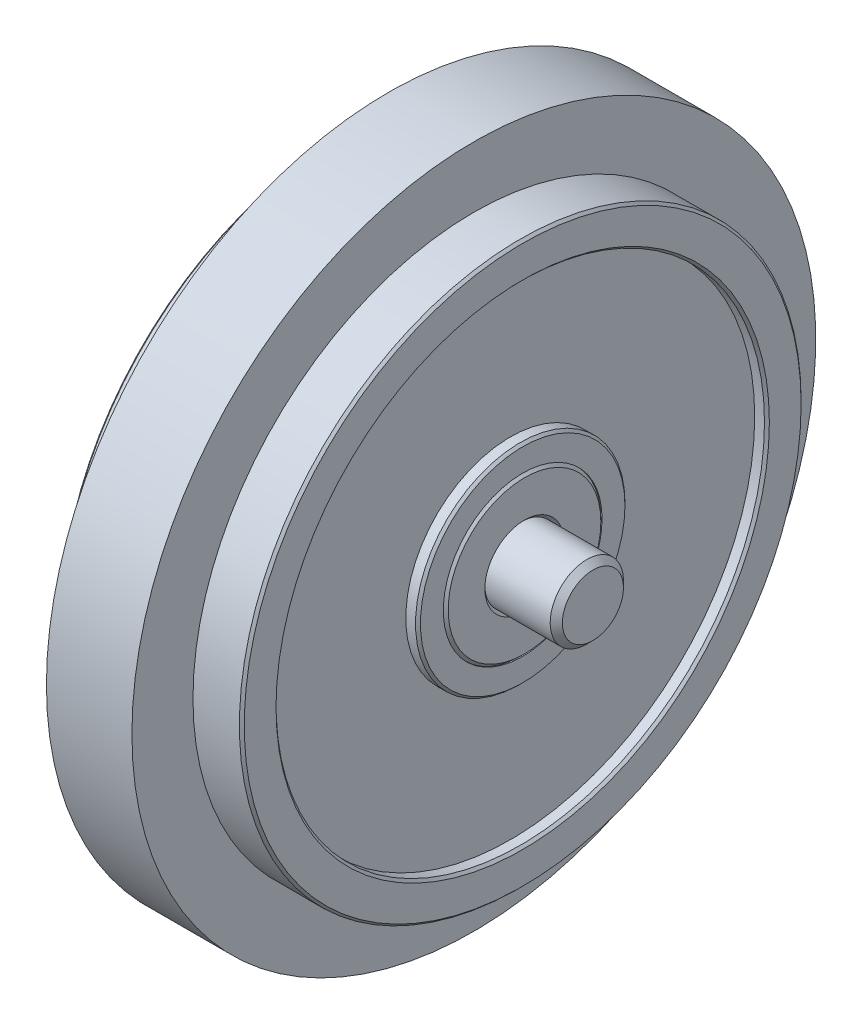
ISO-10303-21;
HEADER;
FILE_DESCRIPTION(('STEP AP214'),'2;1');
FILE_NAME('part.step','',(''),(''),'','','');
FILE_SCHEMA(('AUTOMOTIVE_DESIGN { 1 0 10303 214 1 1 1 1 }'));
ENDSEC;
DATA;
#1=APPLICATION_CONTEXT('core data for automotive mechanical design processes');
#2=APPLICATION_PROTOCOL_DEFINITION('international standard','automotive_design',2000,#1);
#3=PRODUCT_CONTEXT('',#1,'mechanical');
#4=PRODUCT('Part','Part','',(#3));
#5=PRODUCT_RELATED_PRODUCT_CATEGORY('part','',(#4));
#6=PRODUCT_DEFINITION_FORMATION('','',#4);
#7=PRODUCT_DEFINITION_CONTEXT('part definition',#1,'design');
#8=PRODUCT_DEFINITION('design','',#6,#7);
#9=PRODUCT_DEFINITION_SHAPE('','',#8);
#10=(LENGTH_UNIT() NAMED_UNIT(*) SI_UNIT(.MILLI.,.METRE.));
#11=(NAMED_UNIT(*) PLANE_ANGLE_UNIT() SI_UNIT($,.RADIAN.));
#12=(NAMED_UNIT(*) SI_UNIT($,.STERADIAN.) SOLID_ANGLE_UNIT());
#13=UNCERTAINTY_MEASURE_WITH_UNIT(LENGTH_MEASURE(1.E-05),#10,'distance_accuracy_value','');
#14=(GEOMETRIC_REPRESENTATION_CONTEXT(3) GLOBAL_UNCERTAINTY_ASSIGNED_CONTEXT((#13)) GLOBAL_UNIT_ASSIGNED_CONTEXT((#10,
#11,#12)) REPRESENTATION_CONTEXT('',''));
#15=CARTESIAN_POINT('',(0.,0.,0.));
#16=DIRECTION('',(0.,0.,1.));
#17=DIRECTION('',(1.,0.,0.));
#18=AXIS2_PLACEMENT_3D('',#15,#16,#17);
#19=CARTESIAN_POINT('',(6.5,0.,0.));
#20=DIRECTION('',(1.,0.,0.));
#21=DIRECTION('',(0.,0.,-1.));
#22=AXIS2_PLACEMENT_3D('',#19,#20,#21);
#23=CYLINDRICAL_SURFACE('',#22,20.);
#24=CARTESIAN_POINT('',(7.30000000000002,0.,0.));
#25=DIRECTION('',(1.,0.,0.));
#26=DIRECTION('',(0.,0.,-1.));
#27=AXIS2_PLACEMENT_3D('',#24,#25,#26);
#28=CIRCLE('',#27,20.);
#29=CARTESIAN_POINT('',(7.30000000000002,0.,-20.));
#30=VERTEX_POINT('',#29);
#31=EDGE_CURVE('P0_E36',#30,#30,#28,.T.);
#32=ORIENTED_EDGE('',*,*,#31,.T.);
#33=EDGE_LOOP('',(#32));
#34=FACE_BOUND('',#33,.T.);
#35=CARTESIAN_POINT('',(6.5,0.,0.));
#36=DIRECTION('',(1.,0.,0.));
#37=DIRECTION('',(0.,0.,-1.));
#38=AXIS2_PLACEMENT_3D('',#35,#36,#37);
#39=CIRCLE('',#38,20.);
#40=CARTESIAN_POINT('',(6.5,0.,-20.));
#41=VERTEX_POINT('',#40);
#42=EDGE_CURVE('P0_E75',#41,#41,#39,.T.);
#43=ORIENTED_EDGE('',*,*,#42,.F.);
#44=EDGE_LOOP('',(#43));
#45=FACE_BOUND('',#44,.T.);
#46=ADVANCED_FACE('P0_F15',(#34,#45),#23,.F.);
#47=CARTESIAN_POINT('',(6.5,0.,0.));
#48=DIRECTION('',(1.,0.,0.));
#49=DIRECTION('',(0.,0.,-1.));
#50=AXIS2_PLACEMENT_3D('',#47,#48,#49);
#51=CYLINDRICAL_SURFACE('',#50,23.);
#52=CARTESIAN_POINT('',(7.30000000000002,0.,0.));
#53=DIRECTION('',(1.,0.,0.));
#54=DIRECTION('',(0.,0.,-1.));
#55=AXIS2_PLACEMENT_3D('',#52,#53,#54);
#56=CIRCLE('',#55,23.);
#57=CARTESIAN_POINT('',(7.30000000000002,0.,-23.));
#58=VERTEX_POINT('',#57);
#59=EDGE_CURVE('P0_E39',#58,#58,#56,.F.);
#60=ORIENTED_EDGE('',*,*,#59,.T.);
#61=EDGE_LOOP('',(#60));
#62=FACE_BOUND('',#61,.T.);
#63=CARTESIAN_POINT('',(3.5,0.,0.));
#64=DIRECTION('',(-1.,0.,0.));
#65=DIRECTION('',(0.,0.,1.));
#66=AXIS2_PLACEMENT_3D('',#63,#64,#65);
#67=CIRCLE('',#66,23.);
#68=CARTESIAN_POINT('',(3.5,0.,23.));
#69=VERTEX_POINT('',#68);
#70=EDGE_CURVE('P0_E78',#69,#69,#67,.T.);
#71=ORIENTED_EDGE('',*,*,#70,.F.);
#72=EDGE_LOOP('',(#71));
#73=FACE_BOUND('',#72,.T.);
#74=ADVANCED_FACE('P0_F132',(#62,#73),#51,.T.);
#75=CARTESIAN_POINT('',(7.5,0.,0.));
#76=DIRECTION('',(1.,0.,0.));
#77=DIRECTION('',(0.,0.,-1.));
#78=AXIS2_PLACEMENT_3D('',#75,#76,#77);
#79=PLANE('',#78);
#80=CARTESIAN_POINT('',(7.5,0.,0.));
#81=DIRECTION('',(1.,0.,0.));
#82=DIRECTION('',(0.,0.,-1.));
#83=AXIS2_PLACEMENT_3D('',#80,#81,#82);
#84=CIRCLE('',#83,22.8);
#85=CARTESIAN_POINT('',(7.5,0.,-22.8));
#86=VERTEX_POINT('',#85);
#87=EDGE_CURVE('P0_E42',#86,#86,#84,.T.);
#88=ORIENTED_EDGE('',*,*,#87,.T.);
#89=EDGE_LOOP('',(#88));
#90=FACE_BOUND('',#89,.T.);
#91=CARTESIAN_POINT('',(7.5,0.,0.));
#92=DIRECTION('',(1.,0.,0.));
#93=DIRECTION('',(0.,0.,-1.));
#94=AXIS2_PLACEMENT_3D('',#91,#92,#93);
#95=CIRCLE('',#94,20.2);
#96=CARTESIAN_POINT('',(7.5,0.,-20.2));
#97=VERTEX_POINT('',#96);
#98=EDGE_CURVE('P0_E45',#97,#97,#95,.F.);
#99=ORIENTED_EDGE('',*,*,#98,.T.);
#100=EDGE_LOOP('',(#99));
#101=FACE_BOUND('',#100,.T.);
#102=ADVANCED_FACE('P0_F138',(#90,#101),#79,.T.);
#103=CARTESIAN_POINT('',(6.5,0.,0.));
#104=DIRECTION('',(-1.,0.,0.));
#105=DIRECTION('',(0.,0.,1.));
#106=AXIS2_PLACEMENT_3D('',#103,#104,#105);
#107=PLANE('',#106);
#108=CARTESIAN_POINT('',(6.5,0.,0.));
#109=DIRECTION('',(1.,0.,0.));
#110=DIRECTION('',(0.,0.,-1.));
#111=AXIS2_PLACEMENT_3D('',#108,#109,#110);
#112=CIRCLE('',#111,8.575);
#113=CARTESIAN_POINT('',(6.5,0.,-8.575));
#114=VERTEX_POINT('',#113);
#115=EDGE_CURVE('P0_E81',#114,#114,#112,.T.);
#116=ORIENTED_EDGE('',*,*,#115,.F.);
#117=EDGE_LOOP('',(#116));
#118=FACE_BOUND('',#117,.T.);
#119=ORIENTED_EDGE('',*,*,#42,.T.);
#120=EDGE_LOOP('',(#119));
#121=FACE_BOUND('',#120,.T.);
#122=ADVANCED_FACE('P0_F111',(#118,#121),#107,.F.);
#123=CARTESIAN_POINT('',(6.5,0.,0.));
#124=DIRECTION('',(1.,0.,0.));
#125=DIRECTION('',(0.,0.,-1.));
#126=AXIS2_PLACEMENT_3D('',#123,#124,#125);
#127=CYLINDRICAL_SURFACE('',#126,6.5);
#128=CARTESIAN_POINT('',(6.5,0.,0.));
#129=DIRECTION('',(-1.,0.,0.));
#130=DIRECTION('',(0.,0.,1.));
#131=AXIS2_PLACEMENT_3D('',#128,#129,#130);
#132=CIRCLE('',#131,6.5);
#133=CARTESIAN_POINT('',(6.5,0.,6.5));
#134=VERTEX_POINT('',#133);
#135=EDGE_CURVE('P0_E72',#134,#134,#132,.T.);
#136=ORIENTED_EDGE('',*,*,#135,.T.);
#137=EDGE_LOOP('',(#136));
#138=FACE_BOUND('',#137,.T.);
#139=CARTESIAN_POINT('',(7.5,0.,0.));
#140=DIRECTION('',(1.,0.,0.));
#141=DIRECTION('',(0.,0.,-1.));
#142=AXIS2_PLACEMENT_3D('',#139,#140,#141);
#143=CIRCLE('',#142,6.5);
#144=CARTESIAN_POINT('',(7.5,0.,-6.5));
#145=VERTEX_POINT('',#144);
#146=EDGE_CURVE('P0_E82',#145,#145,#143,.T.);
#147=ORIENTED_EDGE('',*,*,#146,.T.);
#148=EDGE_LOOP('',(#147));
#149=FACE_BOUND('',#148,.T.);
#150=ADVANCED_FACE('P0_F114',(#138,#149),#127,.F.);
#151=CARTESIAN_POINT('',(6.5,0.,0.));
#152=DIRECTION('',(1.,0.,0.));
#153=DIRECTION('',(0.,0.,-1.));
#154=AXIS2_PLACEMENT_3D('',#151,#152,#153);
#155=CYLINDRICAL_SURFACE('',#154,8.575);
#156=CARTESIAN_POINT('',(7.3,0.,0.));
#157=DIRECTION('',(1.,0.,0.));
#158=DIRECTION('',(0.,0.,-1.));
#159=AXIS2_PLACEMENT_3D('',#156,#157,#158);
#160=CIRCLE('',#159,8.575);
#161=CARTESIAN_POINT('',(7.3,0.,-8.575));
#162=VERTEX_POINT('',#161);
#163=EDGE_CURVE('P0_E54',#162,#162,#160,.F.);
#164=ORIENTED_EDGE('',*,*,#163,.T.);
#165=EDGE_LOOP('',(#164));
#166=FACE_BOUND('',#165,.T.);
#167=ORIENTED_EDGE('',*,*,#115,.T.);
#168=EDGE_LOOP('',(#167));
#169=FACE_BOUND('',#168,.T.);
#170=ADVANCED_FACE('P0_F117',(#166,#169),#155,.T.);
#171=CARTESIAN_POINT('',(7.5,0.,0.));
#172=DIRECTION('',(1.,0.,0.));
#173=DIRECTION('',(0.,0.,-1.));
#174=AXIS2_PLACEMENT_3D('',#171,#172,#173);
#175=PLANE('',#174);
#176=CARTESIAN_POINT('',(7.5,0.,0.));
#177=DIRECTION('',(1.,0.,0.));
#178=DIRECTION('',(0.,0.,-1.));
#179=AXIS2_PLACEMENT_3D('',#176,#177,#178);
#180=CIRCLE('',#179,8.37499999999999);
#181=CARTESIAN_POINT('',(7.5,0.,-8.37499999999999));
#182=VERTEX_POINT('',#181);
#183=EDGE_CURVE('P0_E57',#182,#182,#180,.T.);
#184=ORIENTED_EDGE('',*,*,#183,.T.);
#185=EDGE_LOOP('',(#184));
#186=FACE_BOUND('',#185,.T.);
#187=ORIENTED_EDGE('',*,*,#146,.F.);
#188=EDGE_LOOP('',(#187));
#189=FACE_BOUND('',#188,.T.);
#190=ADVANCED_FACE('P0_F109',(#186,#189),#175,.T.);
#191=CARTESIAN_POINT('',(6.5,0.,0.));
#192=DIRECTION('',(1.,0.,0.));
#193=DIRECTION('',(0.,0.,-1.));
#194=AXIS2_PLACEMENT_3D('',#191,#192,#193);
#195=CIRCLE('',#194,5.);
#196=CARTESIAN_POINT('',(6.5,0.,-5.));
#197=VERTEX_POINT('',#196);
#198=EDGE_CURVE('P0_E65',#197,#197,#195,.T.);
#199=ORIENTED_EDGE('',*,*,#198,.F.);
#200=EDGE_LOOP('',(#199));
#201=FACE_BOUND('',#200,.T.);
#202=ORIENTED_EDGE('',*,*,#135,.F.);
#203=EDGE_LOOP('',(#202));
#204=FACE_BOUND('',#203,.T.);
#205=ADVANCED_FACE('P0_F105',(#201,#204),#107,.F.);
#206=CARTESIAN_POINT('',(-3.5,0.,0.));
#207=DIRECTION('',(1.,0.,0.));
#208=DIRECTION('',(0.,0.,-1.));
#209=AXIS2_PLACEMENT_3D('',#206,#207,#208);
#210=CYLINDRICAL_SURFACE('',#209,28.);
#211=CARTESIAN_POINT('',(-3.5,0.,0.));
#212=DIRECTION('',(-1.,0.,0.));
#213=DIRECTION('',(0.,0.,1.));
#214=AXIS2_PLACEMENT_3D('',#211,#212,#213);
#215=CIRCLE('',#214,28.);
#216=CARTESIAN_POINT('',(-3.5,0.,28.));
#217=VERTEX_POINT('',#216);
#218=EDGE_CURVE('P0_E85',#217,#217,#215,.T.);
#219=ORIENTED_EDGE('',*,*,#218,.F.);
#220=EDGE_LOOP('',(#219));
#221=FACE_BOUND('',#220,.T.);
#222=CARTESIAN_POINT('',(3.5,0.,0.));
#223=DIRECTION('',(-1.,0.,0.));
#224=DIRECTION('',(0.,0.,1.));
#225=AXIS2_PLACEMENT_3D('',#222,#223,#224);
#226=CIRCLE('',#225,28.);
#227=CARTESIAN_POINT('',(3.5,0.,28.));
#228=VERTEX_POINT('',#227);
#229=EDGE_CURVE('P0_E88',#228,#228,#226,.T.);
#230=ORIENTED_EDGE('',*,*,#229,.T.);
#231=EDGE_LOOP('',(#230));
#232=FACE_BOUND('',#231,.T.);
#233=ADVANCED_FACE('P0_F108',(#221,#232),#210,.T.);
#234=CARTESIAN_POINT('',(-3.5,0.,0.));
#235=DIRECTION('',(-1.,0.,0.));
#236=DIRECTION('',(0.,0.,1.));
#237=AXIS2_PLACEMENT_3D('',#234,#235,#236);
#238=PLANE('',#237);
#239=CARTESIAN_POINT('',(-3.5,0.,0.));
#240=DIRECTION('',(-1.,0.,0.));
#241=DIRECTION('',(0.,0.,1.));
#242=AXIS2_PLACEMENT_3D('',#239,#240,#241);
#243=CIRCLE('',#242,23.);
#244=CARTESIAN_POINT('',(-3.5,0.,23.));
#245=VERTEX_POINT('',#244);
#246=EDGE_CURVE('P0_E71',#245,#245,#243,.T.);
#247=ORIENTED_EDGE('',*,*,#246,.F.);
#248=EDGE_LOOP('',(#247));
#249=FACE_BOUND('',#248,.T.);
#250=ORIENTED_EDGE('',*,*,#218,.T.);
#251=EDGE_LOOP('',(#250));
#252=FACE_BOUND('',#251,.T.);
#253=ADVANCED_FACE('P0_F209',(#249,#252),#238,.T.);
#254=CARTESIAN_POINT('',(3.5,0.,0.));
#255=DIRECTION('',(-1.,0.,0.));
#256=DIRECTION('',(0.,0.,1.));
#257=AXIS2_PLACEMENT_3D('',#254,#255,#256);
#258=PLANE('',#257);
#259=ORIENTED_EDGE('',*,*,#70,.T.);
#260=EDGE_LOOP('',(#259));
#261=FACE_BOUND('',#260,.T.);
#262=ORIENTED_EDGE('',*,*,#229,.F.);
#263=EDGE_LOOP('',(#262));
#264=FACE_BOUND('',#263,.T.);
#265=ADVANCED_FACE('P0_F208',(#261,#264),#258,.F.);
#266=CARTESIAN_POINT('',(-6.5,0.,0.));
#267=DIRECTION('',(1.,0.,0.));
#268=DIRECTION('',(0.,0.,-1.));
#269=AXIS2_PLACEMENT_3D('',#266,#267,#268);
#270=CYLINDRICAL_SURFACE('',#269,23.);
#271=CARTESIAN_POINT('',(-7.30000000000001,0.,0.));
#272=DIRECTION('',(-1.,0.,0.));
#273=DIRECTION('',(0.,0.,1.));
#274=AXIS2_PLACEMENT_3D('',#271,#272,#273);
#275=CIRCLE('',#274,23.);
#276=CARTESIAN_POINT('',(-7.30000000000001,0.,23.));
#277=VERTEX_POINT('',#276);
#278=EDGE_CURVE('P0_E23',#277,#277,#275,.F.);
#279=ORIENTED_EDGE('',*,*,#278,.T.);
#280=EDGE_LOOP('',(#279));
#281=FACE_BOUND('',#280,.T.);
#282=ORIENTED_EDGE('',*,*,#246,.T.);
#283=EDGE_LOOP('',(#282));
#284=FACE_BOUND('',#283,.T.);
#285=ADVANCED_FACE('P0_F201',(#281,#284),#270,.T.);
#286=CARTESIAN_POINT('',(-7.5,0.,0.));
#287=DIRECTION('',(1.,0.,0.));
#288=DIRECTION('',(0.,0.,-1.));
#289=AXIS2_PLACEMENT_3D('',#286,#287,#288);
#290=CYLINDRICAL_SURFACE('',#289,20.);
#291=CARTESIAN_POINT('',(-7.3,0.,0.));
#292=DIRECTION('',(-1.,0.,0.));
#293=DIRECTION('',(0.,0.,1.));
#294=AXIS2_PLACEMENT_3D('',#291,#292,#293);
#295=CIRCLE('',#294,20.);
#296=CARTESIAN_POINT('',(-7.3,0.,20.));
#297=VERTEX_POINT('',#296);
#298=EDGE_CURVE('P0_E10',#297,#297,#295,.T.);
#299=ORIENTED_EDGE('',*,*,#298,.T.);
#300=EDGE_LOOP('',(#299));
#301=FACE_BOUND('',#300,.T.);
#302=CARTESIAN_POINT('',(-6.5,0.,0.));
#303=DIRECTION('',(-1.,0.,0.));
#304=DIRECTION('',(0.,0.,1.));
#305=AXIS2_PLACEMENT_3D('',#302,#303,#304);
#306=CIRCLE('',#305,20.);
#307=CARTESIAN_POINT('',(-6.5,0.,20.));
#308=VERTEX_POINT('',#307);
#309=EDGE_CURVE('P0_E68',#308,#308,#306,.F.);
#310=ORIENTED_EDGE('',*,*,#309,.T.);
#311=EDGE_LOOP('',(#310));
#312=FACE_BOUND('',#311,.T.);
#313=ADVANCED_FACE('P0_F189',(#301,#312),#290,.F.);
#314=CARTESIAN_POINT('',(-7.5,0.,0.));
#315=DIRECTION('',(-1.,0.,0.));
#316=DIRECTION('',(0.,0.,1.));
#317=AXIS2_PLACEMENT_3D('',#314,#315,#316);
#318=PLANE('',#317);
#319=CARTESIAN_POINT('',(-7.5,0.,0.));
#320=DIRECTION('',(-1.,0.,0.));
#321=DIRECTION('',(0.,0.,1.));
#322=AXIS2_PLACEMENT_3D('',#319,#320,#321);
#323=CIRCLE('',#322,22.8);
#324=CARTESIAN_POINT('',(-7.5,0.,22.8));
#325=VERTEX_POINT('',#324);
#326=EDGE_CURVE('P0_E27',#325,#325,#323,.T.);
#327=ORIENTED_EDGE('',*,*,#326,.T.);
#328=EDGE_LOOP('',(#327));
#329=FACE_BOUND('',#328,.T.);
#330=CARTESIAN_POINT('',(-7.5,0.,0.));
#331=DIRECTION('',(-1.,0.,0.));
#332=DIRECTION('',(0.,0.,1.));
#333=AXIS2_PLACEMENT_3D('',#330,#331,#332);
#334=CIRCLE('',#333,20.2);
#335=CARTESIAN_POINT('',(-7.5,0.,20.2));
#336=VERTEX_POINT('',#335);
#337=EDGE_CURVE('P0_E31',#336,#336,#334,.F.);
#338=ORIENTED_EDGE('',*,*,#337,.T.);
#339=EDGE_LOOP('',(#338));
#340=FACE_BOUND('',#339,.T.);
#341=ADVANCED_FACE('P0_F185',(#329,#340),#318,.T.);
#342=CARTESIAN_POINT('',(-6.5,0.,0.));
#343=DIRECTION('',(-1.,0.,0.));
#344=DIRECTION('',(0.,0.,1.));
#345=AXIS2_PLACEMENT_3D('',#342,#343,#344);
#346=PLANE('',#345);
#347=CARTESIAN_POINT('',(-6.5,0.,0.));
#348=DIRECTION('',(-1.,0.,0.));
#349=DIRECTION('',(0.,0.,1.));
#350=AXIS2_PLACEMENT_3D('',#347,#348,#349);
#351=CIRCLE('',#350,8.575);
#352=CARTESIAN_POINT('',(-6.5,0.,8.575));
#353=VERTEX_POINT('',#352);
#354=EDGE_CURVE('P0_E64',#353,#353,#351,.T.);
#355=ORIENTED_EDGE('',*,*,#354,.F.);
#356=EDGE_LOOP('',(#355));
#357=FACE_BOUND('',#356,.T.);
#358=ORIENTED_EDGE('',*,*,#309,.F.);
#359=EDGE_LOOP('',(#358));
#360=FACE_BOUND('',#359,.T.);
#361=ADVANCED_FACE('P0_F188',(#357,#360),#346,.T.);
#362=CARTESIAN_POINT('',(-7.5,0.,0.));
#363=DIRECTION('',(1.,0.,0.));
#364=DIRECTION('',(0.,0.,-1.));
#365=AXIS2_PLACEMENT_3D('',#362,#363,#364);
#366=CYLINDRICAL_SURFACE('',#365,6.5);
#367=CARTESIAN_POINT('',(-7.5,0.,0.));
#368=DIRECTION('',(-1.,0.,0.));
#369=DIRECTION('',(0.,0.,1.));
#370=AXIS2_PLACEMENT_3D('',#367,#368,#369);
#371=CIRCLE('',#370,6.5);
#372=CARTESIAN_POINT('',(-7.5,0.,6.5));
#373=VERTEX_POINT('',#372);
#374=EDGE_CURVE('P0_E91',#373,#373,#371,.T.);
#375=ORIENTED_EDGE('',*,*,#374,.T.);
#376=EDGE_LOOP('',(#375));
#377=FACE_BOUND('',#376,.T.);
#378=CARTESIAN_POINT('',(-6.5,0.,0.));
#379=DIRECTION('',(-1.,0.,0.));
#380=DIRECTION('',(0.,0.,1.));
#381=AXIS2_PLACEMENT_3D('',#378,#379,#380);
#382=CIRCLE('',#381,6.5);
#383=CARTESIAN_POINT('',(-6.5,0.,6.5));
#384=VERTEX_POINT('',#383);
#385=EDGE_CURVE('P0_E60',#384,#384,#382,.F.);
#386=ORIENTED_EDGE('',*,*,#385,.T.);
#387=EDGE_LOOP('',(#386));
#388=FACE_BOUND('',#387,.T.);
#389=ADVANCED_FACE('P0_F197',(#377,#388),#366,.F.);
#390=CARTESIAN_POINT('',(-7.5,0.,0.));
#391=DIRECTION('',(1.,0.,0.));
#392=DIRECTION('',(0.,0.,-1.));
#393=AXIS2_PLACEMENT_3D('',#390,#391,#392);
#394=CYLINDRICAL_SURFACE('',#393,8.575);
#395=CARTESIAN_POINT('',(-7.3,0.,0.));
#396=DIRECTION('',(-1.,0.,0.));
#397=DIRECTION('',(0.,0.,1.));
#398=AXIS2_PLACEMENT_3D('',#395,#396,#397);
#399=CIRCLE('',#398,8.575);
#400=CARTESIAN_POINT('',(-7.3,0.,8.575));
#401=VERTEX_POINT('',#400);
#402=EDGE_CURVE('P0_E48',#401,#401,#399,.F.);
#403=ORIENTED_EDGE('',*,*,#402,.T.);
#404=EDGE_LOOP('',(#403));
#405=FACE_BOUND('',#404,.T.);
#406=ORIENTED_EDGE('',*,*,#354,.T.);
#407=EDGE_LOOP('',(#406));
#408=FACE_BOUND('',#407,.T.);
#409=ADVANCED_FACE('P0_F269',(#405,#408),#394,.T.);
#410=CARTESIAN_POINT('',(-7.5,0.,0.));
#411=DIRECTION('',(-1.,0.,0.));
#412=DIRECTION('',(0.,0.,1.));
#413=AXIS2_PLACEMENT_3D('',#410,#411,#412);
#414=PLANE('',#413);
#415=CARTESIAN_POINT('',(-7.5,0.,0.));
#416=DIRECTION('',(-1.,0.,0.));
#417=DIRECTION('',(0.,0.,1.));
#418=AXIS2_PLACEMENT_3D('',#415,#416,#417);
#419=CIRCLE('',#418,8.37499999999999);
#420=CARTESIAN_POINT('',(-7.5,0.,8.37499999999999));
#421=VERTEX_POINT('',#420);
#422=EDGE_CURVE('P0_E51',#421,#421,#419,.T.);
#423=ORIENTED_EDGE('',*,*,#422,.T.);
#424=EDGE_LOOP('',(#423));
#425=FACE_BOUND('',#424,.T.);
#426=ORIENTED_EDGE('',*,*,#374,.F.);
#427=EDGE_LOOP('',(#426));
#428=FACE_BOUND('',#427,.T.);
#429=ADVANCED_FACE('P0_F279',(#425,#428),#414,.T.);
#430=CARTESIAN_POINT('',(-6.5,0.,0.));
#431=DIRECTION('',(-1.,0.,0.));
#432=DIRECTION('',(0.,0.,1.));
#433=AXIS2_PLACEMENT_3D('',#430,#431,#432);
#434=CIRCLE('',#433,5.);
#435=CARTESIAN_POINT('',(-6.5,0.,-5.));
#436=VERTEX_POINT('',#435);
#437=EDGE_CURVE('P0_E61',#436,#436,#434,.T.);
#438=ORIENTED_EDGE('',*,*,#437,.F.);
#439=EDGE_LOOP('',(#438));
#440=FACE_BOUND('',#439,.T.);
#441=ORIENTED_EDGE('',*,*,#385,.F.);
#442=EDGE_LOOP('',(#441));
#443=FACE_BOUND('',#442,.T.);
#444=ADVANCED_FACE('P0_F200',(#440,#443),#346,.T.);
#445=CARTESIAN_POINT('',(-7.5,0.,0.));
#446=DIRECTION('',(1.,0.,0.));
#447=DIRECTION('',(0.,0.,-1.));
#448=AXIS2_PLACEMENT_3D('',#445,#446,#447);
#449=CYLINDRICAL_SURFACE('',#448,5.);
#450=CARTESIAN_POINT('',(-6.5,0.,-5.));
#451=CARTESIAN_POINT('',(-6.36458333333333,0.,-5.));
#452=CARTESIAN_POINT('',(-6.22916666666667,0.,-5.));
#453=CARTESIAN_POINT('',(-5.95833333333333,0.,-5.));
#454=CARTESIAN_POINT('',(-5.82291666666666,0.,-5.));
#455=CARTESIAN_POINT('',(-5.55208333333333,0.,-5.));
#456=CARTESIAN_POINT('',(-5.41666666666666,0.,-5.));
#457=CARTESIAN_POINT('',(-5.14583333333333,0.,-5.));
#458=CARTESIAN_POINT('',(-5.01041666666667,0.,-5.));
#459=CARTESIAN_POINT('',(-4.73958333333333,0.,-5.));
#460=CARTESIAN_POINT('',(-4.60416666666667,0.,-5.));
#461=CARTESIAN_POINT('',(-4.33333333333333,0.,-5.));
#462=CARTESIAN_POINT('',(-4.19791666666667,0.,-5.));
#463=CARTESIAN_POINT('',(-3.92708333333333,0.,-5.));
#464=CARTESIAN_POINT('',(-3.79166666666667,0.,-5.));
#465=CARTESIAN_POINT('',(-3.52083333333333,0.,-5.));
#466=CARTESIAN_POINT('',(-3.38541666666667,0.,-5.));
#467=CARTESIAN_POINT('',(-3.11458333333333,0.,-5.));
#468=CARTESIAN_POINT('',(-2.97916666666667,0.,-5.));
#469=CARTESIAN_POINT('',(-2.70833333333333,0.,-5.));
#470=CARTESIAN_POINT('',(-2.57291666666667,0.,-5.));
#471=CARTESIAN_POINT('',(-2.30208333333333,0.,-5.));
#472=CARTESIAN_POINT('',(-2.16666666666667,0.,-5.));
#473=CARTESIAN_POINT('',(-1.89583333333333,0.,-5.));
#474=CARTESIAN_POINT('',(-1.76041666666666,0.,-5.));
#475=CARTESIAN_POINT('',(-1.48958333333333,0.,-5.));
#476=CARTESIAN_POINT('',(-1.35416666666666,0.,-5.));
#477=CARTESIAN_POINT('',(-1.08333333333333,0.,-5.));
#478=CARTESIAN_POINT('',(-0.947916666666665,0.,-5.));
#479=CARTESIAN_POINT('',(-0.677083333333332,0.,-5.));
#480=CARTESIAN_POINT('',(-0.541666666666665,0.,-5.));
#481=CARTESIAN_POINT('',(-0.270833333333332,0.,-5.));
#482=CARTESIAN_POINT('',(-0.135416666666665,0.,-5.));
#483=CARTESIAN_POINT('',(0.135416666666668,0.,-5.));
#484=CARTESIAN_POINT('',(0.270833333333335,0.,-5.));
#485=CARTESIAN_POINT('',(0.541666666666668,0.,-5.));
#486=CARTESIAN_POINT('',(0.677083333333335,0.,-5.));
#487=CARTESIAN_POINT('',(0.947916666666668,0.,-5.));
#488=CARTESIAN_POINT('',(1.08333333333333,0.,-5.));
#489=CARTESIAN_POINT('',(1.35416666666667,0.,-5.));
#490=CARTESIAN_POINT('',(1.48958333333333,0.,-5.));
#491=CARTESIAN_POINT('',(1.76041666666667,0.,-5.));
#492=CARTESIAN_POINT('',(1.89583333333333,0.,-5.));
#493=CARTESIAN_POINT('',(2.16666666666667,0.,-5.));
#494=CARTESIAN_POINT('',(2.30208333333333,0.,-5.));
#495=CARTESIAN_POINT('',(2.57291666666667,0.,-5.));
#496=CARTESIAN_POINT('',(2.70833333333333,0.,-5.));
#497=CARTESIAN_POINT('',(2.97916666666667,0.,-5.));
#498=CARTESIAN_POINT('',(3.11458333333333,0.,-5.));
#499=CARTESIAN_POINT('',(3.38541666666667,0.,-5.));
#500=CARTESIAN_POINT('',(3.52083333333333,0.,-5.));
#501=CARTESIAN_POINT('',(3.79166666666667,0.,-5.));
#502=CARTESIAN_POINT('',(3.92708333333334,0.,-5.));
#503=CARTESIAN_POINT('',(4.19791666666667,0.,-5.));
#504=CARTESIAN_POINT('',(4.33333333333334,0.,-5.));
#505=CARTESIAN_POINT('',(4.60416666666667,0.,-5.));
#506=CARTESIAN_POINT('',(4.73958333333334,0.,-5.));
#507=CARTESIAN_POINT('',(5.01041666666667,0.,-5.));
#508=CARTESIAN_POINT('',(5.14583333333334,0.,-5.));
#509=CARTESIAN_POINT('',(5.41666666666667,0.,-5.));
#510=CARTESIAN_POINT('',(5.55208333333333,0.,-5.));
#511=CARTESIAN_POINT('',(5.82291666666667,0.,-5.));
#512=CARTESIAN_POINT('',(5.95833333333333,0.,-5.));
#513=CARTESIAN_POINT('',(6.22916666666667,0.,-5.));
#514=CARTESIAN_POINT('',(6.36458333333333,0.,-5.));
#515=CARTESIAN_POINT('',(6.5,0.,-5.));
#516=B_SPLINE_CURVE_WITH_KNOTS('',3,(#450,#451,#452,#453,#454,#455,#456,#457,#458,#459,#460,
#461,#462,#463,#464,#465,#466,#467,#468,#469,#470,#471,#472,#473,#474,#475,#476,#477,#478,#479,
#480,#481,#482,#483,#484,#485,#486,#487,#488,#489,#490,#491,#492,#493,#494,#495,#496,#497,#498,
#499,#500,#501,#502,#503,#504,#505,#506,#507,#508,#509,#510,#511,#512,#513,#514,#515),
.UNSPECIFIED.,.F.,.F.,(4,2,2,2,2,2,2,2,2,2,2,2,2,2,2,2,2,2,2,2,2,2,2,2,2,2,2,2,2,2,2,2,4),(0.,
0.40625,0.8125,1.21875,1.625,2.03125,2.4375,2.84375,3.25,3.65625,4.0625,4.46875,4.875,5.28125,
5.6875,6.09375,6.5,6.90625,7.3125,7.71875,8.125,8.53125,8.9375,9.34375,9.75,10.15625,10.5625,
10.96875,11.375,11.78125,12.1875,12.59375,13.),.UNSPECIFIED.);
#517=EDGE_CURVE('P0_BSEAM103',#436,#197,#516,.T.);
#518=ORIENTED_EDGE('',*,*,#437,.T.);
#519=ORIENTED_EDGE('',*,*,#198,.T.);
#520=ORIENTED_EDGE('',*,*,#517,.T.);
#521=ORIENTED_EDGE('',*,*,#517,.F.);
#522=EDGE_LOOP('',(#518,#520,#519,#521));
#523=FACE_BOUND('',#522,.T.);
#524=ADVANCED_FACE('P0_F103',(#523),#449,.F.);
#525=CARTESIAN_POINT('',(7.5,0.,0.));
#526=DIRECTION('',(-1.,0.,0.));
#527=DIRECTION('',(0.,0.,1.));
#528=AXIS2_PLACEMENT_3D('',#525,#526,#527);
#529=CONICAL_SURFACE('',#528,8.37499999999999,0.78539816339747);
#530=ORIENTED_EDGE('',*,*,#163,.F.);
#531=EDGE_LOOP('',(#530));
#532=FACE_BOUND('',#531,.T.);
#533=ORIENTED_EDGE('',*,*,#183,.F.);
#534=EDGE_LOOP('',(#533));
#535=FACE_BOUND('',#534,.T.);
#536=ADVANCED_FACE('P0_F145',(#532,#535),#529,.T.);
#537=CARTESIAN_POINT('',(-7.5,0.,0.));
#538=DIRECTION('',(1.,0.,0.));
#539=DIRECTION('',(0.,0.,-1.));
#540=AXIS2_PLACEMENT_3D('',#537,#538,#539);
#541=CONICAL_SURFACE('',#540,8.37499999999999,0.78539816339747);
#542=ORIENTED_EDGE('',*,*,#402,.F.);
#543=EDGE_LOOP('',(#542));
#544=FACE_BOUND('',#543,.T.);
#545=ORIENTED_EDGE('',*,*,#422,.F.);
#546=EDGE_LOOP('',(#545));
#547=FACE_BOUND('',#546,.T.);
#548=ADVANCED_FACE('P0_F152',(#544,#547),#541,.T.);
#549=CARTESIAN_POINT('',(7.5,0.,0.));
#550=DIRECTION('',(-1.,0.,0.));
#551=DIRECTION('',(0.,0.,1.));
#552=AXIS2_PLACEMENT_3D('',#549,#550,#551);
#553=CONICAL_SURFACE('',#552,22.8,0.785398163397457);
#554=ORIENTED_EDGE('',*,*,#59,.F.);
#555=EDGE_LOOP('',(#554));
#556=FACE_BOUND('',#555,.T.);
#557=ORIENTED_EDGE('',*,*,#87,.F.);
#558=EDGE_LOOP('',(#557));
#559=FACE_BOUND('',#558,.T.);
#560=ADVANCED_FACE('P0_F159',(#556,#559),#553,.T.);
#561=CARTESIAN_POINT('',(7.30000000000002,0.,0.));
#562=DIRECTION('',(1.,0.,0.));
#563=DIRECTION('',(0.,0.,-1.));
#564=AXIS2_PLACEMENT_3D('',#561,#562,#563);
#565=CONICAL_SURFACE('',#564,20.,0.785398163397483);
#566=ORIENTED_EDGE('',*,*,#98,.F.);
#567=EDGE_LOOP('',(#566));
#568=FACE_BOUND('',#567,.T.);
#569=ORIENTED_EDGE('',*,*,#31,.F.);
#570=EDGE_LOOP('',(#569));
#571=FACE_BOUND('',#570,.T.);
#572=ADVANCED_FACE('P0_F166',(#568,#571),#565,.F.);
#573=CARTESIAN_POINT('',(-7.5,0.,0.));
#574=DIRECTION('',(1.,0.,0.));
#575=DIRECTION('',(0.,0.,-1.));
#576=AXIS2_PLACEMENT_3D('',#573,#574,#575);
#577=CONICAL_SURFACE('',#576,22.8,0.785398163397483);
#578=ORIENTED_EDGE('',*,*,#278,.F.);
#579=EDGE_LOOP('',(#578));
#580=FACE_BOUND('',#579,.T.);
#581=ORIENTED_EDGE('',*,*,#326,.F.);
#582=EDGE_LOOP('',(#581));
#583=FACE_BOUND('',#582,.T.);
#584=ADVANCED_FACE('P0_F172',(#580,#583),#577,.T.);
#585=CARTESIAN_POINT('',(-7.3,0.,0.));
#586=DIRECTION('',(-1.,0.,0.));
#587=DIRECTION('',(0.,0.,1.));
#588=AXIS2_PLACEMENT_3D('',#585,#586,#587);
#589=CONICAL_SURFACE('',#588,20.,0.785398163397448);
#590=ORIENTED_EDGE('',*,*,#337,.F.);
#591=EDGE_LOOP('',(#590));
#592=FACE_BOUND('',#591,.T.);
#593=ORIENTED_EDGE('',*,*,#298,.F.);
#594=EDGE_LOOP('',(#593));
#595=FACE_BOUND('',#594,.T.);
#596=ADVANCED_FACE('P0_F18',(#592,#595),#589,.F.);
#597=CLOSED_SHELL('',(#46,#74,#102,#122,#150,#170,#190,#205,#233,#253,#265,#285,#313,#341,#361,
#389,#409,#429,#444,#524,#536,#548,#560,#572,#584,#596));
#598=MANIFOLD_SOLID_BREP('P0_B1',#597);
#599=CARTESIAN_POINT('',(-13.25,0.,0.));
#600=DIRECTION('',(1.,0.,0.));
#601=DIRECTION('',(0.,0.,-1.));
#602=AXIS2_PLACEMENT_3D('',#599,#600,#601);
#603=CYLINDRICAL_SURFACE('',#602,3.);
#604=CARTESIAN_POINT('',(12.75,0.,0.));
#605=DIRECTION('',(-1.,0.,0.));
#606=DIRECTION('',(0.,0.,1.));
#607=AXIS2_PLACEMENT_3D('',#604,#605,#606);
#608=CIRCLE('',#607,3.);
#609=CARTESIAN_POINT('',(12.75,0.,3.));
#610=VERTEX_POINT('',#609);
#611=EDGE_CURVE('P1_E27',#610,#610,#608,.T.);
#612=ORIENTED_EDGE('',*,*,#611,.T.);
#613=EDGE_LOOP('',(#612));
#614=FACE_BOUND('',#613,.T.);
#615=CARTESIAN_POINT('',(-12.75,0.,0.));
#616=DIRECTION('',(-1.,0.,0.));
#617=DIRECTION('',(0.,0.,1.));
#618=AXIS2_PLACEMENT_3D('',#615,#616,#617);
#619=CIRCLE('',#618,3.);
#620=CARTESIAN_POINT('',(-12.75,0.,3.));
#621=VERTEX_POINT('',#620);
#622=EDGE_CURVE('P1_E31',#621,#621,#619,.F.);
#623=ORIENTED_EDGE('',*,*,#622,.T.);
#624=EDGE_LOOP('',(#623));
#625=FACE_BOUND('',#624,.T.);
#626=ADVANCED_FACE('P1_F15',(#614,#625),#603,.T.);
#627=CARTESIAN_POINT('',(-13.25,0.,0.));
#628=DIRECTION('',(-1.,0.,0.));
#629=DIRECTION('',(0.,0.,1.));
#630=AXIS2_PLACEMENT_3D('',#627,#628,#629);
#631=PLANE('',#630);
#632=CARTESIAN_POINT('',(-13.25,0.,0.));
#633=DIRECTION('',(-1.,0.,0.));
#634=DIRECTION('',(0.,0.,1.));
#635=AXIS2_PLACEMENT_3D('',#632,#633,#634);
#636=CIRCLE('',#635,2.5);
#637=CARTESIAN_POINT('',(-13.25,0.,2.5));
#638=VERTEX_POINT('',#637);
#639=EDGE_CURVE('P1_E10',#638,#638,#636,.T.);
#640=ORIENTED_EDGE('',*,*,#639,.T.);
#641=EDGE_LOOP('',(#640));
#642=FACE_BOUND('',#641,.T.);
#643=ADVANCED_FACE('P1_F48',(#642),#631,.T.);
#644=CARTESIAN_POINT('',(13.25,0.,0.));
#645=DIRECTION('',(-1.,0.,0.));
#646=DIRECTION('',(0.,0.,1.));
#647=AXIS2_PLACEMENT_3D('',#644,#645,#646);
#648=PLANE('',#647);
#649=CARTESIAN_POINT('',(13.25,0.,0.));
#650=DIRECTION('',(-1.,0.,0.));
#651=DIRECTION('',(0.,0.,1.));
#652=AXIS2_PLACEMENT_3D('',#649,#650,#651);
#653=CIRCLE('',#652,2.49999999999999);
#654=CARTESIAN_POINT('',(13.25,0.,2.49999999999999));
#655=VERTEX_POINT('',#654);
#656=EDGE_CURVE('P1_E23',#655,#655,#653,.F.);
#657=ORIENTED_EDGE('',*,*,#656,.T.);
#658=EDGE_LOOP('',(#657));
#659=FACE_BOUND('',#658,.T.);
#660=ADVANCED_FACE('P1_F45',(#659),#648,.F.);
#661=CARTESIAN_POINT('',(12.75,0.,0.));
#662=DIRECTION('',(-1.,0.,0.));
#663=DIRECTION('',(0.,0.,1.));
#664=AXIS2_PLACEMENT_3D('',#661,#662,#663);
#665=CONICAL_SURFACE('',#664,3.,0.785398163397453);
#666=ORIENTED_EDGE('',*,*,#656,.F.);
#667=EDGE_LOOP('',(#666));
#668=FACE_BOUND('',#667,.T.);
#669=ORIENTED_EDGE('',*,*,#611,.F.);
#670=EDGE_LOOP('',(#669));
#671=FACE_BOUND('',#670,.T.);
#672=ADVANCED_FACE('P1_F40',(#668,#671),#665,.T.);
#673=CARTESIAN_POINT('',(-13.25,0.,0.));
#674=DIRECTION('',(1.,0.,0.));
#675=DIRECTION('',(0.,0.,-1.));
#676=AXIS2_PLACEMENT_3D('',#673,#674,#675);
#677=CONICAL_SURFACE('',#676,2.5,0.78539816339745);
#678=ORIENTED_EDGE('',*,*,#622,.F.);
#679=EDGE_LOOP('',(#678));
#680=FACE_BOUND('',#679,.T.);
#681=ORIENTED_EDGE('',*,*,#639,.F.);
#682=EDGE_LOOP('',(#681));
#683=FACE_BOUND('',#682,.T.);
#684=ADVANCED_FACE('P1_F18',(#680,#683),#677,.T.);
#685=CLOSED_SHELL('',(#626,#643,#660,#672,#684));
#686=MANIFOLD_SOLID_BREP('P1_B1',#685);
#687=CARTESIAN_POINT('',(-3.65,0.,0.));
#688=DIRECTION('',(1.,0.,0.));
#689=DIRECTION('',(0.,0.,-1.));
#690=AXIS2_PLACEMENT_3D('',#687,#688,#689);
#691=PLANE('',#690);
#692=CARTESIAN_POINT('',(-3.65,0.,0.));
#693=DIRECTION('',(1.,0.,0.));
#694=DIRECTION('',(0.,0.,-1.));
#695=AXIS2_PLACEMENT_3D('',#692,#693,#694);
#696=CIRCLE('',#695,6.25);
#697=CARTESIAN_POINT('',(-3.65,0.,-6.25));
#698=VERTEX_POINT('',#697);
#699=EDGE_CURVE('P2_E10',#698,#698,#696,.T.);
#700=ORIENTED_EDGE('',*,*,#699,.T.);
#701=EDGE_LOOP('',(#700));
#702=FACE_BOUND('',#701,.T.);
#703=CARTESIAN_POINT('',(-3.65,0.,0.));
#704=DIRECTION('',(1.,0.,0.));
#705=DIRECTION('',(0.,0.,-1.));
#706=AXIS2_PLACEMENT_3D('',#703,#704,#705);
#707=CIRCLE('',#706,3.25);
#708=CARTESIAN_POINT('',(-3.65,0.,-3.25));
#709=VERTEX_POINT('',#708);
#710=EDGE_CURVE('P2_E23',#709,#709,#707,.F.);
#711=ORIENTED_EDGE('',*,*,#710,.T.);
#712=EDGE_LOOP('',(#711));
#713=FACE_BOUND('',#712,.T.);
#714=ADVANCED_FACE('P2_F15',(#702,#713),#691,.T.);
#715=CARTESIAN_POINT('',(-7.65,0.,0.));
#716=DIRECTION('',(1.,0.,0.));
#717=DIRECTION('',(0.,0.,-1.));
#718=AXIS2_PLACEMENT_3D('',#715,#716,#717);
#719=PLANE('',#718);
#720=CARTESIAN_POINT('',(-7.65,0.,0.));
#721=DIRECTION('',(1.,0.,0.));
#722=DIRECTION('',(0.,0.,-1.));
#723=AXIS2_PLACEMENT_3D('',#720,#721,#722);
#724=CIRCLE('',#723,3.25);
#725=CARTESIAN_POINT('',(-7.65,0.,-3.25));
#726=VERTEX_POINT('',#725);
#727=EDGE_CURVE('P2_E42',#726,#726,#724,.T.);
#728=ORIENTED_EDGE('',*,*,#727,.T.);
#729=EDGE_LOOP('',(#728));
#730=FACE_BOUND('',#729,.T.);
#731=CARTESIAN_POINT('',(-7.65,0.,0.));
#732=DIRECTION('',(1.,0.,0.));
#733=DIRECTION('',(0.,0.,-1.));
#734=AXIS2_PLACEMENT_3D('',#731,#732,#733);
#735=CIRCLE('',#734,6.25);
#736=CARTESIAN_POINT('',(-7.65,0.,-6.25));
#737=VERTEX_POINT('',#736);
#738=EDGE_CURVE('P2_E45',#737,#737,#735,.F.);
#739=ORIENTED_EDGE('',*,*,#738,.T.);
#740=EDGE_LOOP('',(#739));
#741=FACE_BOUND('',#740,.T.);
#742=ADVANCED_FACE('P2_F49',(#730,#741),#719,.F.);
#743=CARTESIAN_POINT('',(-3.65,0.,0.));
#744=DIRECTION('',(-1.,0.,0.));
#745=DIRECTION('',(0.,0.,1.));
#746=AXIS2_PLACEMENT_3D('',#743,#744,#745);
#747=CYLINDRICAL_SURFACE('',#746,6.5);
#748=CARTESIAN_POINT('',(-7.4,0.,0.));
#749=DIRECTION('',(1.,0.,0.));
#750=DIRECTION('',(0.,0.,-1.));
#751=AXIS2_PLACEMENT_3D('',#748,#749,#750);
#752=CIRCLE('',#751,6.5);
#753=CARTESIAN_POINT('',(-7.4,0.,-6.5));
#754=VERTEX_POINT('',#753);
#755=EDGE_CURVE('P2_E27',#754,#754,#752,.T.);
#756=ORIENTED_EDGE('',*,*,#755,.T.);
#757=EDGE_LOOP('',(#756));
#758=FACE_BOUND('',#757,.T.);
#759=CARTESIAN_POINT('',(-3.9,0.,0.));
#760=DIRECTION('',(1.,0.,0.));
#761=DIRECTION('',(0.,0.,-1.));
#762=AXIS2_PLACEMENT_3D('',#759,#760,#761);
#763=CIRCLE('',#762,6.5);
#764=CARTESIAN_POINT('',(-3.9,0.,-6.5));
#765=VERTEX_POINT('',#764);
#766=EDGE_CURVE('P2_E31',#765,#765,#763,.F.);
#767=ORIENTED_EDGE('',*,*,#766,.T.);
#768=EDGE_LOOP('',(#767));
#769=FACE_BOUND('',#768,.T.);
#770=ADVANCED_FACE('P2_F59',(#758,#769),#747,.T.);
#771=CARTESIAN_POINT('',(-3.65,0.,0.));
#772=DIRECTION('',(-1.,0.,0.));
#773=DIRECTION('',(0.,0.,1.));
#774=AXIS2_PLACEMENT_3D('',#771,#772,#773);
#775=CYLINDRICAL_SURFACE('',#774,3.);
#776=CARTESIAN_POINT('',(-7.4,0.,0.));
#777=DIRECTION('',(1.,0.,0.));
#778=DIRECTION('',(0.,0.,-1.));
#779=AXIS2_PLACEMENT_3D('',#776,#777,#778);
#780=CIRCLE('',#779,3.);
#781=CARTESIAN_POINT('',(-7.4,0.,-3.));
#782=VERTEX_POINT('',#781);
#783=EDGE_CURVE('P2_E36',#782,#782,#780,.F.);
#784=ORIENTED_EDGE('',*,*,#783,.T.);
#785=EDGE_LOOP('',(#784));
#786=FACE_BOUND('',#785,.T.);
#787=CARTESIAN_POINT('',(-3.9,0.,0.));
#788=DIRECTION('',(1.,0.,0.));
#789=DIRECTION('',(0.,0.,-1.));
#790=AXIS2_PLACEMENT_3D('',#787,#788,#789);
#791=CIRCLE('',#790,3.);
#792=CARTESIAN_POINT('',(-3.9,0.,-3.));
#793=VERTEX_POINT('',#792);
#794=EDGE_CURVE('P2_E39',#793,#793,#791,.T.);
#795=ORIENTED_EDGE('',*,*,#794,.T.);
#796=EDGE_LOOP('',(#795));
#797=FACE_BOUND('',#796,.T.);
#798=ADVANCED_FACE('P2_F62',(#786,#797),#775,.F.);
#799=CARTESIAN_POINT('',(-7.65,0.,0.));
#800=DIRECTION('',(-1.,0.,0.));
#801=DIRECTION('',(0.,0.,1.));
#802=AXIS2_PLACEMENT_3D('',#799,#800,#801);
#803=CONICAL_SURFACE('',#802,3.25,0.785398163397449);
#804=ORIENTED_EDGE('',*,*,#783,.F.);
#805=EDGE_LOOP('',(#804));
#806=FACE_BOUND('',#805,.T.);
#807=ORIENTED_EDGE('',*,*,#727,.F.);
#808=EDGE_LOOP('',(#807));
#809=FACE_BOUND('',#808,.T.);
#810=ADVANCED_FACE('P2_F55',(#806,#809),#803,.F.);
#811=CARTESIAN_POINT('',(-7.4,0.,0.));
#812=DIRECTION('',(1.,0.,0.));
#813=DIRECTION('',(0.,0.,-1.));
#814=AXIS2_PLACEMENT_3D('',#811,#812,#813);
#815=CONICAL_SURFACE('',#814,6.5,0.785398163397448);
#816=ORIENTED_EDGE('',*,*,#738,.F.);
#817=EDGE_LOOP('',(#816));
#818=FACE_BOUND('',#817,.T.);
#819=ORIENTED_EDGE('',*,*,#755,.F.);
#820=EDGE_LOOP('',(#819));
#821=FACE_BOUND('',#820,.T.);
#822=ADVANCED_FACE('P2_F51',(#818,#821),#815,.T.);
#823=CARTESIAN_POINT('',(-3.65,0.,0.));
#824=DIRECTION('',(-1.,0.,0.));
#825=DIRECTION('',(0.,0.,1.));
#826=AXIS2_PLACEMENT_3D('',#823,#824,#825);
#827=CONICAL_SURFACE('',#826,6.25,0.785398163397448);
#828=ORIENTED_EDGE('',*,*,#766,.F.);
#829=EDGE_LOOP('',(#828));
#830=FACE_BOUND('',#829,.T.);
#831=ORIENTED_EDGE('',*,*,#699,.F.);
#832=EDGE_LOOP('',(#831));
#833=FACE_BOUND('',#832,.T.);
#834=ADVANCED_FACE('P2_F54',(#830,#833),#827,.T.);
#835=CARTESIAN_POINT('',(-3.9,0.,0.));
#836=DIRECTION('',(1.,0.,0.));
#837=DIRECTION('',(0.,0.,-1.));
#838=AXIS2_PLACEMENT_3D('',#835,#836,#837);
#839=CONICAL_SURFACE('',#838,3.,0.785398163397452);
#840=ORIENTED_EDGE('',*,*,#710,.F.);
#841=EDGE_LOOP('',(#840));
#842=FACE_BOUND('',#841,.T.);
#843=ORIENTED_EDGE('',*,*,#794,.F.);
#844=EDGE_LOOP('',(#843));
#845=FACE_BOUND('',#844,.T.);
#846=ADVANCED_FACE('P2_F18',(#842,#845),#839,.F.);
#847=CLOSED_SHELL('',(#714,#742,#770,#798,#810,#822,#834,#846));
#848=MANIFOLD_SOLID_BREP('P2_B1',#847);
#849=CARTESIAN_POINT('',(7.65,0.,0.));
#850=DIRECTION('',(1.,0.,0.));
#851=DIRECTION('',(0.,0.,-1.));
#852=AXIS2_PLACEMENT_3D('',#849,#850,#851);
#853=PLANE('',#852);
#854=CARTESIAN_POINT('',(7.65,0.,0.));
#855=DIRECTION('',(1.,0.,0.));
#856=DIRECTION('',(0.,0.,-1.));
#857=AXIS2_PLACEMENT_3D('',#854,#855,#856);
#858=CIRCLE('',#857,6.25);
#859=CARTESIAN_POINT('',(7.65,0.,-6.25));
#860=VERTEX_POINT('',#859);
#861=EDGE_CURVE('P3_E9',#860,#860,#858,.T.);
#862=ORIENTED_EDGE('',*,*,#861,.T.);
#863=EDGE_LOOP('',(#862));
#864=FACE_BOUND('',#863,.T.);
#865=CARTESIAN_POINT('',(7.65,0.,0.));
#866=DIRECTION('',(1.,0.,0.));
#867=DIRECTION('',(0.,0.,-1.));
#868=AXIS2_PLACEMENT_3D('',#865,#866,#867);
#869=CIRCLE('',#868,3.25);
#870=CARTESIAN_POINT('',(7.65,0.,-3.25));
#871=VERTEX_POINT('',#870);
#872=EDGE_CURVE('P3_E22',#871,#871,#869,.F.);
#873=ORIENTED_EDGE('',*,*,#872,.T.);
#874=EDGE_LOOP('',(#873));
#875=FACE_BOUND('',#874,.T.);
#876=ADVANCED_FACE('P3_F14',(#864,#875),#853,.T.);
#877=CARTESIAN_POINT('',(3.65,0.,0.));
#878=DIRECTION('',(1.,0.,0.));
#879=DIRECTION('',(0.,0.,-1.));
#880=AXIS2_PLACEMENT_3D('',#877,#878,#879);
#881=PLANE('',#880);
#882=CARTESIAN_POINT('',(3.65,0.,0.));
#883=DIRECTION('',(1.,0.,0.));
#884=DIRECTION('',(0.,0.,-1.));
#885=AXIS2_PLACEMENT_3D('',#882,#883,#884);
#886=CIRCLE('',#885,3.25);
#887=CARTESIAN_POINT('',(3.65,0.,-3.25));
#888=VERTEX_POINT('',#887);
#889=EDGE_CURVE('P3_E41',#888,#888,#886,.T.);
#890=ORIENTED_EDGE('',*,*,#889,.T.);
#891=EDGE_LOOP('',(#890));
#892=FACE_BOUND('',#891,.T.);
#893=CARTESIAN_POINT('',(3.65,0.,0.));
#894=DIRECTION('',(1.,0.,0.));
#895=DIRECTION('',(0.,0.,-1.));
#896=AXIS2_PLACEMENT_3D('',#893,#894,#895);
#897=CIRCLE('',#896,6.25);
#898=CARTESIAN_POINT('',(3.65,0.,-6.25));
#899=VERTEX_POINT('',#898);
#900=EDGE_CURVE('P3_E44',#899,#899,#897,.F.);
#901=ORIENTED_EDGE('',*,*,#900,.T.);
#902=EDGE_LOOP('',(#901));
#903=FACE_BOUND('',#902,.T.);
#904=ADVANCED_FACE('P3_F48',(#892,#903),#881,.F.);
#905=CARTESIAN_POINT('',(7.65,0.,0.));
#906=DIRECTION('',(-1.,0.,0.));
#907=DIRECTION('',(0.,0.,1.));
#908=AXIS2_PLACEMENT_3D('',#905,#906,#907);
#909=CYLINDRICAL_SURFACE('',#908,6.5);
#910=CARTESIAN_POINT('',(3.9,0.,0.));
#911=DIRECTION('',(1.,0.,0.));
#912=DIRECTION('',(0.,0.,-1.));
#913=AXIS2_PLACEMENT_3D('',#910,#911,#912);
#914=CIRCLE('',#913,6.5);
#915=CARTESIAN_POINT('',(3.9,0.,-6.5));
#916=VERTEX_POINT('',#915);
#917=EDGE_CURVE('P3_E26',#916,#916,#914,.T.);
#918=ORIENTED_EDGE('',*,*,#917,.T.);
#919=EDGE_LOOP('',(#918));
#920=FACE_BOUND('',#919,.T.);
#921=CARTESIAN_POINT('',(7.4,0.,0.));
#922=DIRECTION('',(1.,0.,0.));
#923=DIRECTION('',(0.,0.,-1.));
#924=AXIS2_PLACEMENT_3D('',#921,#922,#923);
#925=CIRCLE('',#924,6.5);
#926=CARTESIAN_POINT('',(7.4,0.,-6.5));
#927=VERTEX_POINT('',#926);
#928=EDGE_CURVE('P3_E30',#927,#927,#925,.F.);
#929=ORIENTED_EDGE('',*,*,#928,.T.);
#930=EDGE_LOOP('',(#929));
#931=FACE_BOUND('',#930,.T.);
#932=ADVANCED_FACE('P3_F58',(#920,#931),#909,.T.);
#933=CARTESIAN_POINT('',(7.65,0.,0.));
#934=DIRECTION('',(-1.,0.,0.));
#935=DIRECTION('',(0.,0.,1.));
#936=AXIS2_PLACEMENT_3D('',#933,#934,#935);
#937=CYLINDRICAL_SURFACE('',#936,3.);
#938=CARTESIAN_POINT('',(3.9,0.,0.));
#939=DIRECTION('',(1.,0.,0.));
#940=DIRECTION('',(0.,0.,-1.));
#941=AXIS2_PLACEMENT_3D('',#938,#939,#940);
#942=CIRCLE('',#941,3.);
#943=CARTESIAN_POINT('',(3.9,0.,-3.));
#944=VERTEX_POINT('',#943);
#945=EDGE_CURVE('P3_E35',#944,#944,#942,.F.);
#946=ORIENTED_EDGE('',*,*,#945,.T.);
#947=EDGE_LOOP('',(#946));
#948=FACE_BOUND('',#947,.T.);
#949=CARTESIAN_POINT('',(7.4,0.,0.));
#950=DIRECTION('',(1.,0.,0.));
#951=DIRECTION('',(0.,0.,-1.));
#952=AXIS2_PLACEMENT_3D('',#949,#950,#951);
#953=CIRCLE('',#952,3.);
#954=CARTESIAN_POINT('',(7.4,0.,-3.));
#955=VERTEX_POINT('',#954);
#956=EDGE_CURVE('P3_E38',#955,#955,#953,.T.);
#957=ORIENTED_EDGE('',*,*,#956,.T.);
#958=EDGE_LOOP('',(#957));
#959=FACE_BOUND('',#958,.T.);
#960=ADVANCED_FACE('P3_F61',(#948,#959),#937,.F.);
#961=CARTESIAN_POINT('',(3.65,0.,0.));
#962=DIRECTION('',(-1.,0.,0.));
#963=DIRECTION('',(0.,0.,1.));
#964=AXIS2_PLACEMENT_3D('',#961,#962,#963);
#965=CONICAL_SURFACE('',#964,3.25,0.785398163397449);
#966=ORIENTED_EDGE('',*,*,#945,.F.);
#967=EDGE_LOOP('',(#966));
#968=FACE_BOUND('',#967,.T.);
#969=ORIENTED_EDGE('',*,*,#889,.F.);
#970=EDGE_LOOP('',(#969));
#971=FACE_BOUND('',#970,.T.);
#972=ADVANCED_FACE('P3_F54',(#968,#971),#965,.F.);
#973=CARTESIAN_POINT('',(3.9,0.,0.));
#974=DIRECTION('',(1.,0.,0.));
#975=DIRECTION('',(0.,0.,-1.));
#976=AXIS2_PLACEMENT_3D('',#973,#974,#975);
#977=CONICAL_SURFACE('',#976,6.5,0.785398163397448);
#978=ORIENTED_EDGE('',*,*,#900,.F.);
#979=EDGE_LOOP('',(#978));
#980=FACE_BOUND('',#979,.T.);
#981=ORIENTED_EDGE('',*,*,#917,.F.);
#982=EDGE_LOOP('',(#981));
#983=FACE_BOUND('',#982,.T.);
#984=ADVANCED_FACE('P3_F50',(#980,#983),#977,.T.);
#985=CARTESIAN_POINT('',(7.65,0.,0.));
#986=DIRECTION('',(-1.,0.,0.));
#987=DIRECTION('',(0.,0.,1.));
#988=AXIS2_PLACEMENT_3D('',#985,#986,#987);
#989=CONICAL_SURFACE('',#988,6.25,0.785398163397448);
#990=ORIENTED_EDGE('',*,*,#928,.F.);
#991=EDGE_LOOP('',(#990));
#992=FACE_BOUND('',#991,.T.);
#993=ORIENTED_EDGE('',*,*,#861,.F.);
#994=EDGE_LOOP('',(#993));
#995=FACE_BOUND('',#994,.T.);
#996=ADVANCED_FACE('P3_F53',(#992,#995),#989,.T.);
#997=CARTESIAN_POINT('',(7.4,0.,0.));
#998=DIRECTION('',(1.,0.,0.));
#999=DIRECTION('',(0.,0.,-1.));
#1000=AXIS2_PLACEMENT_3D('',#997,#998,#999);
#1001=CONICAL_SURFACE('',#1000,3.,0.785398163397452);
#1002=ORIENTED_EDGE('',*,*,#872,.F.);
#1003=EDGE_LOOP('',(#1002));
#1004=FACE_BOUND('',#1003,.T.);
#1005=ORIENTED_EDGE('',*,*,#956,.F.);
#1006=EDGE_LOOP('',(#1005));
#1007=FACE_BOUND('',#1006,.T.);
#1008=ADVANCED_FACE('P3_F17',(#1004,#1007),#1001,.F.);
#1009=CLOSED_SHELL('',(#876,#904,#932,#960,#972,#984,#996,#1008));
#1010=MANIFOLD_SOLID_BREP('P3_B1',#1009);
#1011=ADVANCED_BREP_SHAPE_REPRESENTATION('',(#18,#598,#686,#848,#1010),#14);
#1012=SHAPE_DEFINITION_REPRESENTATION(#9,#1011);
ENDSEC;
END-ISO-10303-21;
